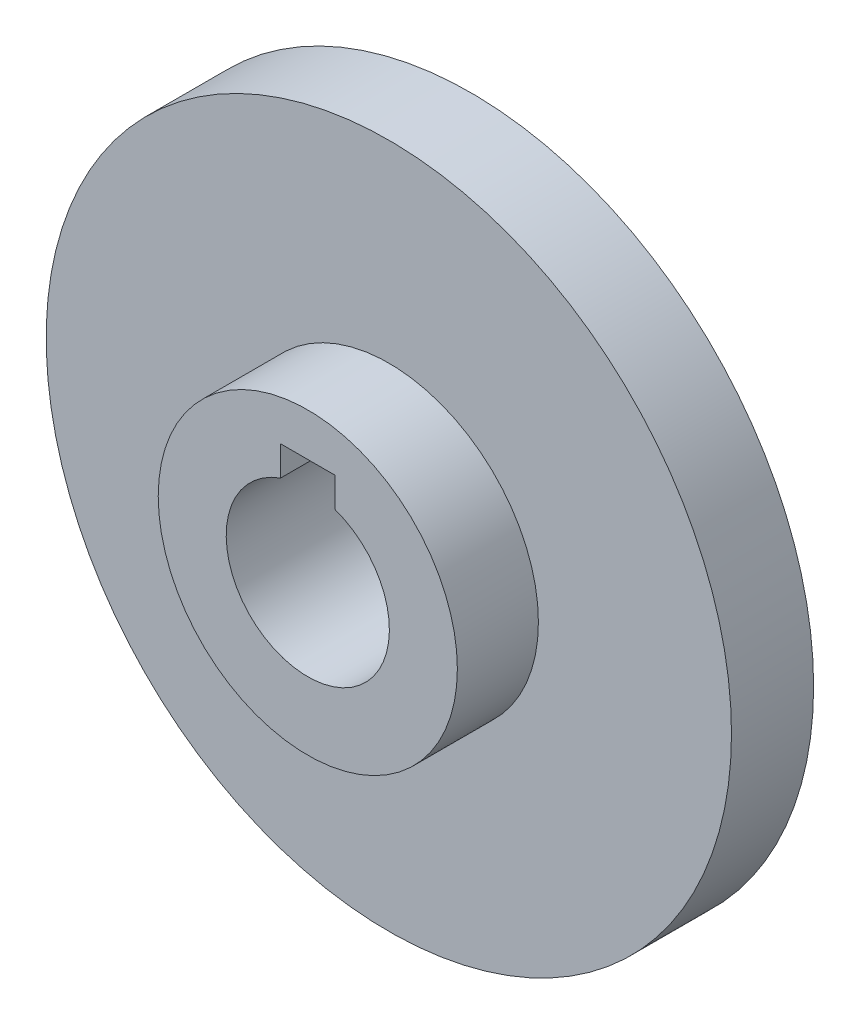
ISO-10303-21;
HEADER;
FILE_DESCRIPTION(('STEP AP214'),'2;1');
FILE_NAME('part.step','',(''),(''),'','','');
FILE_SCHEMA(('AUTOMOTIVE_DESIGN { 1 0 10303 214 1 1 1 1 }'));
ENDSEC;
DATA;
#1=APPLICATION_CONTEXT('core data for automotive mechanical design processes');
#2=APPLICATION_PROTOCOL_DEFINITION('international standard','automotive_design',2000,#1);
#3=PRODUCT_CONTEXT('',#1,'mechanical');
#4=PRODUCT('Part','Part','',(#3));
#5=PRODUCT_RELATED_PRODUCT_CATEGORY('part','',(#4));
#6=PRODUCT_DEFINITION_FORMATION('','',#4);
#7=PRODUCT_DEFINITION_CONTEXT('part definition',#1,'design');
#8=PRODUCT_DEFINITION('design','',#6,#7);
#9=PRODUCT_DEFINITION_SHAPE('','',#8);
#10=(LENGTH_UNIT() NAMED_UNIT(*) SI_UNIT(.MILLI.,.METRE.));
#11=(NAMED_UNIT(*) PLANE_ANGLE_UNIT() SI_UNIT($,.RADIAN.));
#12=(NAMED_UNIT(*) SI_UNIT($,.STERADIAN.) SOLID_ANGLE_UNIT());
#13=UNCERTAINTY_MEASURE_WITH_UNIT(LENGTH_MEASURE(1.E-05),#10,'distance_accuracy_value','');
#14=(GEOMETRIC_REPRESENTATION_CONTEXT(3) GLOBAL_UNCERTAINTY_ASSIGNED_CONTEXT((#13)) GLOBAL_UNIT_ASSIGNED_CONTEXT((#10,
#11,#12)) REPRESENTATION_CONTEXT('',''));
#15=CARTESIAN_POINT('',(0.,0.,0.));
#16=DIRECTION('',(0.,0.,1.));
#17=DIRECTION('',(1.,0.,0.));
#18=AXIS2_PLACEMENT_3D('',#15,#16,#17);
#19=CARTESIAN_POINT('',(0.,0.,7.55));
#20=DIRECTION('',(0.,0.,1.));
#21=DIRECTION('',(1.,0.,0.));
#22=AXIS2_PLACEMENT_3D('',#19,#20,#21);
#23=PLANE('',#22);
#24=CARTESIAN_POINT('',(0.,0.,7.55));
#25=DIRECTION('',(0.,0.,1.));
#26=DIRECTION('',(1.,0.,0.));
#27=AXIS2_PLACEMENT_3D('',#24,#25,#26);
#28=CIRCLE('',#27,31.5);
#29=CARTESIAN_POINT('',(31.5,0.,7.55));
#30=VERTEX_POINT('',#29);
#31=EDGE_CURVE('E11',#30,#30,#28,.T.);
#32=ORIENTED_EDGE('',*,*,#31,.T.);
#33=EDGE_LOOP('',(#32));
#34=FACE_BOUND('',#33,.T.);
#35=CARTESIAN_POINT('',(0.,0.,7.55));
#36=DIRECTION('',(0.,0.,1.));
#37=DIRECTION('',(1.,0.,0.));
#38=AXIS2_PLACEMENT_3D('',#35,#36,#37);
#39=CIRCLE('',#38,13.75);
#40=CARTESIAN_POINT('',(13.75,0.,7.55));
#41=VERTEX_POINT('',#40);
#42=EDGE_CURVE('E112',#41,#41,#39,.T.);
#43=ORIENTED_EDGE('',*,*,#42,.F.);
#44=EDGE_LOOP('',(#43));
#45=FACE_BOUND('',#44,.T.);
#46=ADVANCED_FACE('F36',(#34,#45),#23,.T.);
#47=CARTESIAN_POINT('',(0.,0.,0.));
#48=DIRECTION('',(0.,0.,1.));
#49=DIRECTION('',(1.,0.,0.));
#50=AXIS2_PLACEMENT_3D('',#47,#48,#49);
#51=PLANE('',#50);
#52=CARTESIAN_POINT('',(0.,0.,0.));
#53=DIRECTION('',(0.,0.,1.));
#54=DIRECTION('',(1.,0.,0.));
#55=AXIS2_PLACEMENT_3D('',#52,#53,#54);
#56=CIRCLE('',#55,7.5);
#57=CARTESIAN_POINT('',(-2.5,7.07106781186548,0.));
#58=VERTEX_POINT('',#57);
#59=CARTESIAN_POINT('',(2.5,7.07106781186548,0.));
#60=VERTEX_POINT('',#59);
#61=EDGE_CURVE('E116',#58,#60,#56,.T.);
#62=ORIENTED_EDGE('',*,*,#61,.T.);
#63=DIRECTION('',(0.,1.,0.));
#64=VECTOR('',#63,1.);
#65=CARTESIAN_POINT('',(2.5,0.,0.));
#66=LINE('',#65,#64);
#67=CARTESIAN_POINT('',(2.5,9.8,0.));
#68=VERTEX_POINT('',#67);
#69=EDGE_CURVE('E57',#60,#68,#66,.T.);
#70=ORIENTED_EDGE('',*,*,#69,.T.);
#71=DIRECTION('',(-1.,0.,0.));
#72=VECTOR('',#71,1.);
#73=CARTESIAN_POINT('',(0.,9.8,0.));
#74=LINE('',#73,#72);
#75=CARTESIAN_POINT('',(-2.5,9.8,0.));
#76=VERTEX_POINT('',#75);
#77=EDGE_CURVE('E82',#68,#76,#74,.T.);
#78=ORIENTED_EDGE('',*,*,#77,.T.);
#79=DIRECTION('',(0.,-1.,0.));
#80=VECTOR('',#79,1.);
#81=CARTESIAN_POINT('',(-2.5,0.,0.));
#82=LINE('',#81,#80);
#83=EDGE_CURVE('E90',#76,#58,#82,.T.);
#84=ORIENTED_EDGE('',*,*,#83,.T.);
#85=EDGE_LOOP('',(#62,#70,#78,#84));
#86=FACE_BOUND('',#85,.T.);
#87=CARTESIAN_POINT('',(0.,0.,0.));
#88=DIRECTION('',(0.,0.,1.));
#89=DIRECTION('',(1.,0.,0.));
#90=AXIS2_PLACEMENT_3D('',#87,#88,#89);
#91=CIRCLE('',#90,31.5);
#92=CARTESIAN_POINT('',(31.5,0.,0.));
#93=VERTEX_POINT('',#92);
#94=EDGE_CURVE('E40',#93,#93,#91,.T.);
#95=ORIENTED_EDGE('',*,*,#94,.F.);
#96=EDGE_LOOP('',(#95));
#97=FACE_BOUND('',#96,.T.);
#98=ADVANCED_FACE('F97',(#86,#97),#51,.F.);
#99=CARTESIAN_POINT('',(0.,0.,7.55));
#100=DIRECTION('',(0.,0.,-1.));
#101=DIRECTION('',(-1.,0.,0.));
#102=AXIS2_PLACEMENT_3D('',#99,#100,#101);
#103=CYLINDRICAL_SURFACE('',#102,31.5);
#104=ORIENTED_EDGE('',*,*,#31,.F.);
#105=EDGE_LOOP('',(#104));
#106=FACE_BOUND('',#105,.T.);
#107=ORIENTED_EDGE('',*,*,#94,.T.);
#108=EDGE_LOOP('',(#107));
#109=FACE_BOUND('',#108,.T.);
#110=ADVANCED_FACE('F38',(#106,#109),#103,.T.);
#111=CARTESIAN_POINT('',(0.,0.,7.55));
#112=DIRECTION('',(0.,0.,-1.));
#113=DIRECTION('',(-1.,0.,0.));
#114=AXIS2_PLACEMENT_3D('',#111,#112,#113);
#115=CYLINDRICAL_SURFACE('',#114,7.5);
#116=DIRECTION('',(0.,0.,1.));
#117=VECTOR('',#116,1.);
#118=CARTESIAN_POINT('',(2.5,7.07106781186548,0.));
#119=LINE('',#118,#117);
#120=CARTESIAN_POINT('',(2.5,7.07106781186548,15.));
#121=VERTEX_POINT('',#120);
#122=EDGE_CURVE('E71',#60,#121,#119,.T.);
#123=ORIENTED_EDGE('',*,*,#122,.F.);
#124=ORIENTED_EDGE('',*,*,#61,.F.);
#125=DIRECTION('',(0.,0.,1.));
#126=VECTOR('',#125,1.);
#127=CARTESIAN_POINT('',(-2.5,7.07106781186548,0.));
#128=LINE('',#127,#126);
#129=CARTESIAN_POINT('',(-2.5,7.07106781186548,15.));
#130=VERTEX_POINT('',#129);
#131=EDGE_CURVE('E87',#58,#130,#128,.T.);
#132=ORIENTED_EDGE('',*,*,#131,.T.);
#133=CARTESIAN_POINT('',(0.,0.,15.));
#134=DIRECTION('',(0.,0.,1.));
#135=DIRECTION('',(1.,0.,0.));
#136=AXIS2_PLACEMENT_3D('',#133,#134,#135);
#137=CIRCLE('',#136,7.5);
#138=EDGE_CURVE('E107',#130,#121,#137,.T.);
#139=ORIENTED_EDGE('',*,*,#138,.T.);
#140=EDGE_LOOP('',(#123,#124,#132,#139));
#141=FACE_BOUND('',#140,.T.);
#142=ADVANCED_FACE('F127',(#141),#115,.F.);
#143=CARTESIAN_POINT('',(0.,0.,15.));
#144=DIRECTION('',(0.,0.,1.));
#145=DIRECTION('',(1.,0.,0.));
#146=AXIS2_PLACEMENT_3D('',#143,#144,#145);
#147=PLANE('',#146);
#148=DIRECTION('',(0.,1.,0.));
#149=VECTOR('',#148,1.);
#150=CARTESIAN_POINT('',(2.5,0.,15.));
#151=LINE('',#150,#149);
#152=CARTESIAN_POINT('',(2.5,9.8,15.));
#153=VERTEX_POINT('',#152);
#154=EDGE_CURVE('E51',#121,#153,#151,.T.);
#155=ORIENTED_EDGE('',*,*,#154,.F.);
#156=ORIENTED_EDGE('',*,*,#138,.F.);
#157=DIRECTION('',(0.,-1.,0.));
#158=VECTOR('',#157,1.);
#159=CARTESIAN_POINT('',(-2.5,0.,15.));
#160=LINE('',#159,#158);
#161=CARTESIAN_POINT('',(-2.5,9.8,15.));
#162=VERTEX_POINT('',#161);
#163=EDGE_CURVE('E100',#162,#130,#160,.T.);
#164=ORIENTED_EDGE('',*,*,#163,.F.);
#165=DIRECTION('',(-1.,0.,0.));
#166=VECTOR('',#165,1.);
#167=CARTESIAN_POINT('',(0.,9.8,15.));
#168=LINE('',#167,#166);
#169=EDGE_CURVE('E84',#153,#162,#168,.T.);
#170=ORIENTED_EDGE('',*,*,#169,.F.);
#171=EDGE_LOOP('',(#155,#156,#164,#170));
#172=FACE_BOUND('',#171,.T.);
#173=CARTESIAN_POINT('',(0.,0.,15.));
#174=DIRECTION('',(0.,0.,1.));
#175=DIRECTION('',(1.,0.,0.));
#176=AXIS2_PLACEMENT_3D('',#173,#174,#175);
#177=CIRCLE('',#176,13.75);
#178=CARTESIAN_POINT('',(13.75,0.,15.));
#179=VERTEX_POINT('',#178);
#180=EDGE_CURVE('E113',#179,#179,#177,.T.);
#181=ORIENTED_EDGE('',*,*,#180,.T.);
#182=EDGE_LOOP('',(#181));
#183=FACE_BOUND('',#182,.T.);
#184=ADVANCED_FACE('F134',(#172,#183),#147,.T.);
#185=CARTESIAN_POINT('',(0.,0.,15.));
#186=DIRECTION('',(0.,0.,-1.));
#187=DIRECTION('',(-1.,0.,0.));
#188=AXIS2_PLACEMENT_3D('',#185,#186,#187);
#189=CYLINDRICAL_SURFACE('',#188,13.75);
#190=ORIENTED_EDGE('',*,*,#180,.F.);
#191=EDGE_LOOP('',(#190));
#192=FACE_BOUND('',#191,.T.);
#193=ORIENTED_EDGE('',*,*,#42,.T.);
#194=EDGE_LOOP('',(#193));
#195=FACE_BOUND('',#194,.T.);
#196=ADVANCED_FACE('F136',(#192,#195),#189,.T.);
#197=CARTESIAN_POINT('',(2.5,0.,0.));
#198=DIRECTION('',(1.,0.,0.));
#199=DIRECTION('',(0.,0.,-1.));
#200=AXIS2_PLACEMENT_3D('',#197,#198,#199);
#201=PLANE('',#200);
#202=ORIENTED_EDGE('',*,*,#154,.T.);
#203=DIRECTION('',(0.,0.,1.));
#204=VECTOR('',#203,1.);
#205=CARTESIAN_POINT('',(2.5,9.8,0.));
#206=LINE('',#205,#204);
#207=EDGE_CURVE('E73',#68,#153,#206,.T.);
#208=ORIENTED_EDGE('',*,*,#207,.F.);
#209=ORIENTED_EDGE('',*,*,#69,.F.);
#210=ORIENTED_EDGE('',*,*,#122,.T.);
#211=EDGE_LOOP('',(#202,#208,#209,#210));
#212=FACE_BOUND('',#211,.T.);
#213=ADVANCED_FACE('F139',(#212),#201,.F.);
#214=CARTESIAN_POINT('',(-2.5,0.,0.));
#215=DIRECTION('',(-1.,0.,0.));
#216=DIRECTION('',(0.,0.,1.));
#217=AXIS2_PLACEMENT_3D('',#214,#215,#216);
#218=PLANE('',#217);
#219=ORIENTED_EDGE('',*,*,#163,.T.);
#220=ORIENTED_EDGE('',*,*,#131,.F.);
#221=ORIENTED_EDGE('',*,*,#83,.F.);
#222=DIRECTION('',(0.,0.,1.));
#223=VECTOR('',#222,1.);
#224=CARTESIAN_POINT('',(-2.5,9.8,0.));
#225=LINE('',#224,#223);
#226=EDGE_CURVE('E78',#76,#162,#225,.T.);
#227=ORIENTED_EDGE('',*,*,#226,.T.);
#228=EDGE_LOOP('',(#219,#220,#221,#227));
#229=FACE_BOUND('',#228,.T.);
#230=ADVANCED_FACE('F91',(#229),#218,.F.);
#231=CARTESIAN_POINT('',(0.,9.8,0.));
#232=DIRECTION('',(0.,1.,0.));
#233=DIRECTION('',(0.,0.,1.));
#234=AXIS2_PLACEMENT_3D('',#231,#232,#233);
#235=PLANE('',#234);
#236=ORIENTED_EDGE('',*,*,#169,.T.);
#237=ORIENTED_EDGE('',*,*,#226,.F.);
#238=ORIENTED_EDGE('',*,*,#77,.F.);
#239=ORIENTED_EDGE('',*,*,#207,.T.);
#240=EDGE_LOOP('',(#236,#237,#238,#239));
#241=FACE_BOUND('',#240,.T.);
#242=ADVANCED_FACE('F80',(#241),#235,.F.);
#243=CLOSED_SHELL('',(#46,#98,#110,#142,#184,#196,#213,#230,#242));
#244=MANIFOLD_SOLID_BREP('B2',#243);
#245=ADVANCED_BREP_SHAPE_REPRESENTATION('',(#18,#244),#14);
#246=SHAPE_DEFINITION_REPRESENTATION(#9,#245);
ENDSEC;
END-ISO-10303-21;
